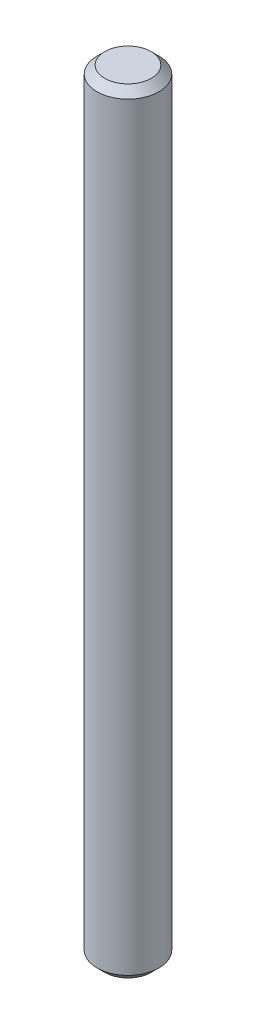
ISO-10303-21;
HEADER;
FILE_DESCRIPTION(('STEP AP214'),'2;1');
FILE_NAME('part.step','',(''),(''),'','','');
FILE_SCHEMA(('AUTOMOTIVE_DESIGN { 1 0 10303 214 1 1 1 1 }'));
ENDSEC;
DATA;
#1=APPLICATION_CONTEXT('core data for automotive mechanical design processes');
#2=APPLICATION_PROTOCOL_DEFINITION('international standard','automotive_design',2000,#1);
#3=PRODUCT_CONTEXT('',#1,'mechanical');
#4=PRODUCT('Part','Part','',(#3));
#5=PRODUCT_RELATED_PRODUCT_CATEGORY('part','',(#4));
#6=PRODUCT_DEFINITION_FORMATION('','',#4);
#7=PRODUCT_DEFINITION_CONTEXT('part definition',#1,'design');
#8=PRODUCT_DEFINITION('design','',#6,#7);
#9=PRODUCT_DEFINITION_SHAPE('','',#8);
#10=(LENGTH_UNIT() NAMED_UNIT(*) SI_UNIT(.MILLI.,.METRE.));
#11=(NAMED_UNIT(*) PLANE_ANGLE_UNIT() SI_UNIT($,.RADIAN.));
#12=(NAMED_UNIT(*) SI_UNIT($,.STERADIAN.) SOLID_ANGLE_UNIT());
#13=UNCERTAINTY_MEASURE_WITH_UNIT(LENGTH_MEASURE(1.E-05),#10,'distance_accuracy_value','');
#14=(GEOMETRIC_REPRESENTATION_CONTEXT(3) GLOBAL_UNCERTAINTY_ASSIGNED_CONTEXT((#13)) GLOBAL_UNIT_ASSIGNED_CONTEXT((#10,
#11,#12)) REPRESENTATION_CONTEXT('',''));
#15=CARTESIAN_POINT('',(0.,0.,0.));
#16=DIRECTION('',(0.,0.,1.));
#17=DIRECTION('',(1.,0.,0.));
#18=AXIS2_PLACEMENT_3D('',#15,#16,#17);
#19=CARTESIAN_POINT('',(0.,100.,0.));
#20=DIRECTION('',(0.,-1.,0.));
#21=DIRECTION('',(0.,0.,-1.));
#22=AXIS2_PLACEMENT_3D('',#19,#20,#21);
#23=CYLINDRICAL_SURFACE('',#22,4.);
#24=CARTESIAN_POINT('',(0.,0.999999999999987,0.));
#25=DIRECTION('',(0.,1.,0.));
#26=DIRECTION('',(0.,0.,1.));
#27=AXIS2_PLACEMENT_3D('',#24,#25,#26);
#28=CIRCLE('',#27,4.);
#29=CARTESIAN_POINT('',(0.,0.999999999999987,4.));
#30=VERTEX_POINT('',#29);
#31=EDGE_CURVE('E46',#30,#30,#28,.T.);
#32=ORIENTED_EDGE('',*,*,#31,.T.);
#33=EDGE_LOOP('',(#32));
#34=FACE_BOUND('',#33,.T.);
#35=CARTESIAN_POINT('',(0.,99.,0.));
#36=DIRECTION('',(0.,1.,0.));
#37=DIRECTION('',(0.,0.,1.));
#38=AXIS2_PLACEMENT_3D('',#35,#36,#37);
#39=CIRCLE('',#38,4.);
#40=CARTESIAN_POINT('',(0.,99.,4.));
#41=VERTEX_POINT('',#40);
#42=EDGE_CURVE('E50',#41,#41,#39,.F.);
#43=ORIENTED_EDGE('',*,*,#42,.T.);
#44=EDGE_LOOP('',(#43));
#45=FACE_BOUND('',#44,.T.);
#46=ADVANCED_FACE('F34',(#34,#45),#23,.T.);
#47=CARTESIAN_POINT('',(0.,100.,0.));
#48=DIRECTION('',(0.,1.,0.));
#49=DIRECTION('',(0.,0.,1.));
#50=AXIS2_PLACEMENT_3D('',#47,#48,#49);
#51=PLANE('',#50);
#52=CARTESIAN_POINT('',(0.,100.,0.));
#53=DIRECTION('',(0.,1.,0.));
#54=DIRECTION('',(0.,0.,1.));
#55=AXIS2_PLACEMENT_3D('',#52,#53,#54);
#56=CIRCLE('',#55,3.00000000000002);
#57=CARTESIAN_POINT('',(0.,100.,3.00000000000002));
#58=VERTEX_POINT('',#57);
#59=EDGE_CURVE('E10',#58,#58,#56,.T.);
#60=ORIENTED_EDGE('',*,*,#59,.T.);
#61=EDGE_LOOP('',(#60));
#62=FACE_BOUND('',#61,.T.);
#63=ADVANCED_FACE('F66',(#62),#51,.T.);
#64=CARTESIAN_POINT('',(0.,0.,0.));
#65=DIRECTION('',(0.,1.,0.));
#66=DIRECTION('',(0.,0.,1.));
#67=AXIS2_PLACEMENT_3D('',#64,#65,#66);
#68=PLANE('',#67);
#69=CARTESIAN_POINT('',(0.,0.,0.));
#70=DIRECTION('',(0.,1.,0.));
#71=DIRECTION('',(0.,0.,1.));
#72=AXIS2_PLACEMENT_3D('',#69,#70,#71);
#73=CIRCLE('',#72,3.00000000000002);
#74=CARTESIAN_POINT('',(0.,0.,3.00000000000002));
#75=VERTEX_POINT('',#74);
#76=EDGE_CURVE('E42',#75,#75,#73,.F.);
#77=ORIENTED_EDGE('',*,*,#76,.T.);
#78=EDGE_LOOP('',(#77));
#79=FACE_BOUND('',#78,.T.);
#80=ADVANCED_FACE('F63',(#79),#68,.F.);
#81=CARTESIAN_POINT('',(0.,0.999999999999987,0.));
#82=DIRECTION('',(0.,1.,0.));
#83=DIRECTION('',(0.,0.,1.));
#84=AXIS2_PLACEMENT_3D('',#81,#82,#83);
#85=CONICAL_SURFACE('',#84,4.,0.785398163397447);
#86=ORIENTED_EDGE('',*,*,#76,.F.);
#87=EDGE_LOOP('',(#86));
#88=FACE_BOUND('',#87,.T.);
#89=ORIENTED_EDGE('',*,*,#31,.F.);
#90=EDGE_LOOP('',(#89));
#91=FACE_BOUND('',#90,.T.);
#92=ADVANCED_FACE('F59',(#88,#91),#85,.T.);
#93=CARTESIAN_POINT('',(0.,100.,0.));
#94=DIRECTION('',(0.,-1.,0.));
#95=DIRECTION('',(0.,0.,-1.));
#96=AXIS2_PLACEMENT_3D('',#93,#94,#95);
#97=CONICAL_SURFACE('',#96,3.00000000000002,0.78539816339744);
#98=ORIENTED_EDGE('',*,*,#42,.F.);
#99=EDGE_LOOP('',(#98));
#100=FACE_BOUND('',#99,.T.);
#101=ORIENTED_EDGE('',*,*,#59,.F.);
#102=EDGE_LOOP('',(#101));
#103=FACE_BOUND('',#102,.T.);
#104=ADVANCED_FACE('F37',(#100,#103),#97,.T.);
#105=CLOSED_SHELL('',(#46,#63,#80,#92,#104));
#106=MANIFOLD_SOLID_BREP('B2',#105);
#107=ADVANCED_BREP_SHAPE_REPRESENTATION('',(#18,#106),#14);
#108=SHAPE_DEFINITION_REPRESENTATION(#9,#107);
ENDSEC;
END-ISO-10303-21;
